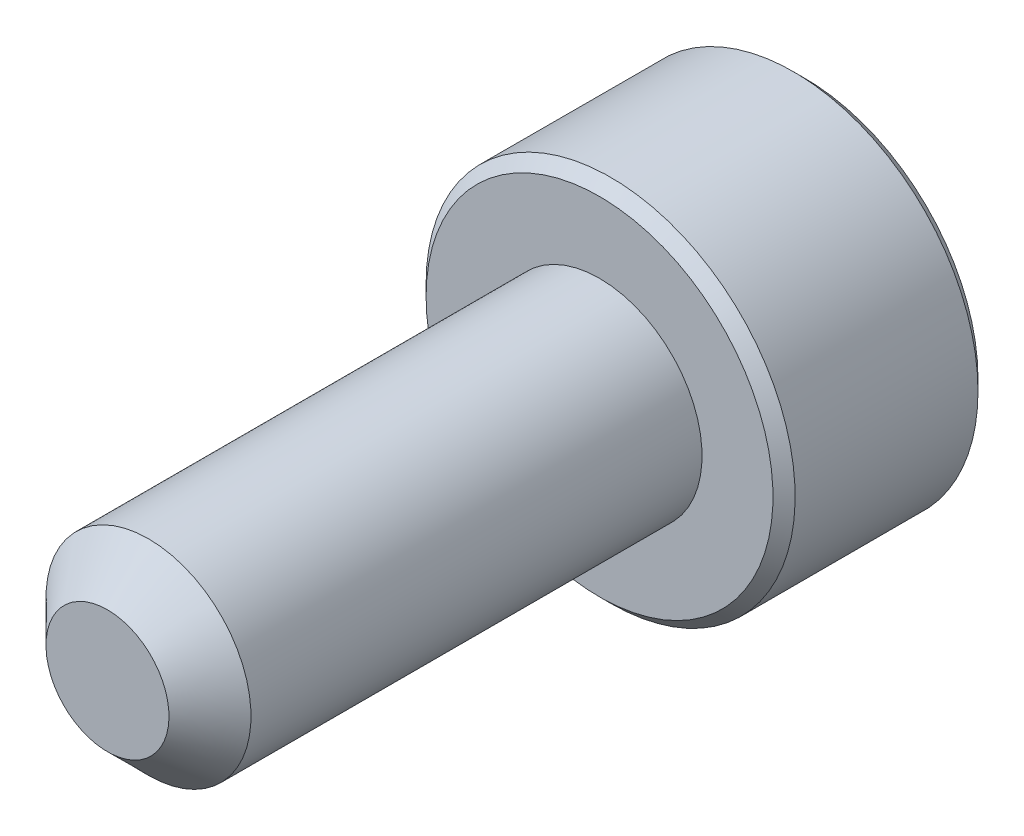
ISO-10303-21;
HEADER;
FILE_DESCRIPTION(('STEP AP214'),'2;1');
FILE_NAME('part.step','',(''),(''),'','','');
FILE_SCHEMA(('AUTOMOTIVE_DESIGN { 1 0 10303 214 1 1 1 1 }'));
ENDSEC;
DATA;
#1=APPLICATION_CONTEXT('core data for automotive mechanical design processes');
#2=APPLICATION_PROTOCOL_DEFINITION('international standard','automotive_design',2000,#1);
#3=PRODUCT_CONTEXT('',#1,'mechanical');
#4=PRODUCT('Part','Part','',(#3));
#5=PRODUCT_RELATED_PRODUCT_CATEGORY('part','',(#4));
#6=PRODUCT_DEFINITION_FORMATION('','',#4);
#7=PRODUCT_DEFINITION_CONTEXT('part definition',#1,'design');
#8=PRODUCT_DEFINITION('design','',#6,#7);
#9=PRODUCT_DEFINITION_SHAPE('','',#8);
#10=(LENGTH_UNIT() NAMED_UNIT(*) SI_UNIT(.MILLI.,.METRE.));
#11=(NAMED_UNIT(*) PLANE_ANGLE_UNIT() SI_UNIT($,.RADIAN.));
#12=(NAMED_UNIT(*) SI_UNIT($,.STERADIAN.) SOLID_ANGLE_UNIT());
#13=UNCERTAINTY_MEASURE_WITH_UNIT(LENGTH_MEASURE(1.E-05),#10,'distance_accuracy_value','');
#14=(GEOMETRIC_REPRESENTATION_CONTEXT(3) GLOBAL_UNCERTAINTY_ASSIGNED_CONTEXT((#13)) GLOBAL_UNIT_ASSIGNED_CONTEXT((#10,
#11,#12)) REPRESENTATION_CONTEXT('',''));
#15=CARTESIAN_POINT('',(0.,0.,0.));
#16=DIRECTION('',(0.,0.,1.));
#17=DIRECTION('',(1.,0.,0.));
#18=AXIS2_PLACEMENT_3D('',#15,#16,#17);
#19=CARTESIAN_POINT('',(-0.999999999999945,-0.577350269189647,-6.99999999999999));
#20=DIRECTION('',(-1.,0.,0.));
#21=DIRECTION('',(0.,-1.,0.));
#22=AXIS2_PLACEMENT_3D('',#19,#20,#21);
#23=PLANE('',#22);
#24=CARTESIAN_POINT('',(-0.999999999999945,0.577350269190027,-8.50000000001262));
#25=CARTESIAN_POINT('',(-0.999999999999945,0.537921916685755,-8.48030421855517));
#26=CARTESIAN_POINT('',(-0.999999999999945,0.497838522943099,-8.46175847655676));
#27=CARTESIAN_POINT('',(-0.999999999999945,0.416089218046397,-8.42776375688669));
#28=CARTESIAN_POINT('',(-0.999999999999945,0.374414806967093,-8.41233540065581));
#29=CARTESIAN_POINT('',(-0.999999999999945,0.289861522962884,-8.3856939453934));
#30=CARTESIAN_POINT('',(-0.999999999999945,0.246987267630393,-8.37446658059238));
#31=CARTESIAN_POINT('',(-0.999999999999945,0.160298880626419,-8.35718156712562));
#32=CARTESIAN_POINT('',(-0.999999999999945,0.116488090760256,-8.35110793188256));
#33=CARTESIAN_POINT('',(-0.999999999999945,0.0604313809769499,-8.34705063441562));
#34=CARTESIAN_POINT('',(-0.999999999999945,0.0483511656802593,-8.34639469636689));
#35=CARTESIAN_POINT('',(-0.999999999999945,0.0241811978518301,-8.34551903058784));
#36=CARTESIAN_POINT('',(-0.999999999999945,0.0120914540759211,-8.34529906589528));
#37=CARTESIAN_POINT('',(-0.999999999999945,-0.030347173158268,-8.34530045485742));
#38=CARTESIAN_POINT('',(-0.999999999999945,-0.060705119690449,-8.34668952341283));
#39=CARTESIAN_POINT('',(-0.999999999999945,-0.121184237328988,-8.35216330142793));
#40=CARTESIAN_POINT('',(-0.999999999999945,-0.151305228451821,-8.35624989103257));
#41=CARTESIAN_POINT('',(-0.999999999999945,-0.241266773027065,-8.37230046210294));
#42=CARTESIAN_POINT('',(-0.999999999999945,-0.300451693273536,-8.38805252340354));
#43=CARTESIAN_POINT('',(-0.999999999999945,-0.396054922754772,-8.42027718346385));
#44=CARTESIAN_POINT('',(-0.999999999999945,-0.433252086820168,-8.43460640136483));
#45=CARTESIAN_POINT('',(-0.999999999999945,-0.50623796164584,-8.46566243983718));
#46=CARTESIAN_POINT('',(-0.999999999999945,-0.542036442977672,-8.48236613193539));
#47=CARTESIAN_POINT('',(-0.999999999999945,-0.577350269190039,-8.50000000001258));
#48=B_SPLINE_CURVE_WITH_KNOTS('',3,(#24,#25,#26,#27,#28,#29,#30,#31,#32,#33,#34,#35,#36,#37,#38,
#39,#40,#41,#42,#43,#44,#45,#46,#47),.UNSPECIFIED.,.F.,.F.,(4,2,2,2,2,2,2,2,2,2,2,4),(0.,
0.132313199455714,0.265474890463239,0.398180194920119,0.530472334347778,0.56676091552446,
0.603029767550235,0.694057457500559,0.785148659918884,0.96808357834418,1.08759246657118,
1.20600826495498),.UNSPECIFIED.);
#49=CARTESIAN_POINT('',(-1.00000000000602,0.57735026919312,-8.50000000001943));
#50=VERTEX_POINT('',#49);
#51=CARTESIAN_POINT('',(-1.00000000000601,-0.577350269193129,-8.50000000001938));
#52=VERTEX_POINT('',#51);
#53=EDGE_CURVE('E21',#50,#52,#48,.T.);
#54=ORIENTED_EDGE('',*,*,#53,.F.);
#55=DIRECTION('',(0.,0.,1.));
#56=VECTOR('',#55,1.);
#57=CARTESIAN_POINT('',(-1.00000000000001,0.577350269189651,-6.99999999999992));
#58=LINE('',#57,#56);
#59=CARTESIAN_POINT('',(-0.999999999999986,0.577350269189663,-6.99999999999995));
#60=VERTEX_POINT('',#59);
#61=EDGE_CURVE('E66',#50,#60,#58,.T.);
#62=ORIENTED_EDGE('',*,*,#61,.T.);
#63=DIRECTION('',(0.,1.,0.));
#64=VECTOR('',#63,1.);
#65=CARTESIAN_POINT('',(-0.999999999999945,1.73205080756887,-6.99999999999999));
#66=LINE('',#65,#64);
#67=CARTESIAN_POINT('',(-0.999999999999944,-0.577350269189646,-6.99999999999998));
#68=VERTEX_POINT('',#67);
#69=EDGE_CURVE('E71',#68,#60,#66,.T.);
#70=ORIENTED_EDGE('',*,*,#69,.F.);
#71=DIRECTION('',(0.,0.,1.));
#72=VECTOR('',#71,1.);
#73=CARTESIAN_POINT('',(-0.999999999999944,-0.577350269189645,-6.99999999999998));
#74=LINE('',#73,#72);
#75=EDGE_CURVE('E69',#68,#52,#74,.F.);
#76=ORIENTED_EDGE('',*,*,#75,.T.);
#77=EDGE_LOOP('',(#54,#62,#70,#76));
#78=FACE_BOUND('',#77,.T.);
#79=ADVANCED_FACE('F17',(#78),#23,.F.);
#80=CARTESIAN_POINT('',(0.999999999999946,1.73205080756887,-6.99999999999999));
#81=DIRECTION('',(0.,0.,-1.));
#82=DIRECTION('',(0.,1.,0.));
#83=AXIS2_PLACEMENT_3D('',#80,#81,#82);
#84=PLANE('',#83);
#85=DIRECTION('',(0.866025403784439,-0.5,0.));
#86=VECTOR('',#85,1.);
#87=CARTESIAN_POINT('',(0.,-1.15470053837924,-6.99999999999998));
#88=LINE('',#87,#86);
#89=CARTESIAN_POINT('',(0.,-1.15470053837928,-6.99999999999997));
#90=VERTEX_POINT('',#89);
#91=EDGE_CURVE('E89',#90,#68,#88,.F.);
#92=ORIENTED_EDGE('',*,*,#91,.T.);
#93=ORIENTED_EDGE('',*,*,#69,.T.);
#94=DIRECTION('',(-0.866025403784439,-0.5,0.));
#95=VECTOR('',#94,1.);
#96=CARTESIAN_POINT('',(-1.,0.577350269189653,-6.99999999999992));
#97=LINE('',#96,#95);
#98=CARTESIAN_POINT('',(0.,1.15470053837928,-6.99999999999995));
#99=VERTEX_POINT('',#98);
#100=EDGE_CURVE('E88',#60,#99,#97,.F.);
#101=ORIENTED_EDGE('',*,*,#100,.T.);
#102=DIRECTION('',(-0.866025403784439,0.5,0.));
#103=VECTOR('',#102,1.);
#104=CARTESIAN_POINT('',(0.,1.15470053837927,-6.99999999999996));
#105=LINE('',#104,#103);
#106=CARTESIAN_POINT('',(1.00000000000005,0.577350269189648,-6.99999999999996));
#107=VERTEX_POINT('',#106);
#108=EDGE_CURVE('E235',#99,#107,#105,.F.);
#109=ORIENTED_EDGE('',*,*,#108,.T.);
#110=DIRECTION('',(0.,1.,0.));
#111=VECTOR('',#110,1.);
#112=CARTESIAN_POINT('',(1.00000000000003,0.577350269189597,-6.99999999999996));
#113=LINE('',#112,#111);
#114=CARTESIAN_POINT('',(1.00000000000003,-0.57735026918967,-6.99999999999996));
#115=VERTEX_POINT('',#114);
#116=EDGE_CURVE('E240',#107,#115,#113,.F.);
#117=ORIENTED_EDGE('',*,*,#116,.T.);
#118=DIRECTION('',(0.866025403784439,0.5,0.));
#119=VECTOR('',#118,1.);
#120=CARTESIAN_POINT('',(1.,-0.577350269189674,-6.99999999999996));
#121=LINE('',#120,#119);
#122=EDGE_CURVE('E245',#115,#90,#121,.F.);
#123=ORIENTED_EDGE('',*,*,#122,.T.);
#124=EDGE_LOOP('',(#92,#93,#101,#109,#117,#123));
#125=FACE_BOUND('',#124,.T.);
#126=ADVANCED_FACE('F169',(#125),#84,.T.);
#127=CARTESIAN_POINT('',(-1.,0.577350269189653,-6.99999999999992));
#128=DIRECTION('',(-0.5,0.866025403784439,0.));
#129=DIRECTION('',(-0.866025403784439,-0.5,0.));
#130=AXIS2_PLACEMENT_3D('',#127,#128,#129);
#131=PLANE('',#130);
#132=CARTESIAN_POINT('',(-1.00000000000031,0.577350269189475,-8.50000000001267));
#133=CARTESIAN_POINT('',(-0.96562946444635,0.597194107143746,-8.48017529969772));
#134=CARTESIAN_POINT('',(-0.930684324317608,0.617369693203944,-8.46151503363672));
#135=CARTESIAN_POINT('',(-0.85942759693806,0.658509783938098,-8.42734887688827));
#136=CARTESIAN_POINT('',(-0.823109236868685,0.679478198900678,-8.4118619899878));
#137=CARTESIAN_POINT('',(-0.749874902280919,0.721760061688847,-8.38533304034807));
#138=CARTESIAN_POINT('',(-0.712977570520169,0.743062746113296,-8.37422431256372));
#139=CARTESIAN_POINT('',(-0.638371399482348,0.786136639045189,-8.35710848690352));
#140=CARTESIAN_POINT('',(-0.600664836281809,0.807906533459236,-8.35108861983243));
#141=CARTESIAN_POINT('',(-0.535672283940884,0.845430001048589,-8.34565888474912));
#142=CARTESIAN_POINT('',(-0.508470695174633,0.86113484564517,-8.34485656692259));
#143=CARTESIAN_POINT('',(-0.454120291273569,0.892514065968014,-8.3462087797417));
#144=CARTESIAN_POINT('',(-0.426971489122761,0.908188434197959,-8.34836396354681));
#145=CARTESIAN_POINT('',(-0.3459129720901,0.954987590826877,-8.35912331969345));
#146=CARTESIAN_POINT('',(-0.29240676263656,0.985879415258195,-8.37202250820472));
#147=CARTESIAN_POINT('',(-0.19853726063635,1.04007499750671,-8.40313768060925));
#148=CARTESIAN_POINT('',(-0.157732128928676,1.06363385128246,-8.41971698773794));
#149=CARTESIAN_POINT('',(-0.0777188012055219,1.10982956758218,-8.4570612849801));
#150=CARTESIAN_POINT('',(-0.0385058937149511,1.13246915027757,-8.47781264965678));
#151=CARTESIAN_POINT('',(1.90759481100758E-12,1.15470053838038,-8.50000000001358));
#152=B_SPLINE_CURVE_WITH_KNOTS('',3,(#132,#133,#134,#135,#136,#137,#138,#139,#140,#141,#142,
#143,#144,#145,#146,#147,#148,#149,#150,#151),.UNSPECIFIED.,.F.,.F.,(4,2,2,2,2,2,2,2,2,4),(0.,
0.133182946580773,0.267141541466459,0.398973326815026,0.530473323703193,0.624596460448788,
0.718740387483229,0.907081600587882,1.05673041330056,1.20589820623807),.UNSPECIFIED.);
#153=CARTESIAN_POINT('',(-1.1059764589726E-11,1.15470053838678,-8.50000000001998));
#154=VERTEX_POINT('',#153);
#155=EDGE_CURVE('E85',#50,#154,#152,.T.);
#156=ORIENTED_EDGE('',*,*,#155,.T.);
#157=DIRECTION('',(0.,0.,1.));
#158=VECTOR('',#157,1.);
#159=CARTESIAN_POINT('',(0.,1.15470053837927,-6.99999999999996));
#160=LINE('',#159,#158);
#161=EDGE_CURVE('E96',#154,#99,#160,.T.);
#162=ORIENTED_EDGE('',*,*,#161,.T.);
#163=ORIENTED_EDGE('',*,*,#100,.F.);
#164=ORIENTED_EDGE('',*,*,#61,.F.);
#165=EDGE_LOOP('',(#156,#162,#163,#164));
#166=FACE_BOUND('',#165,.T.);
#167=ADVANCED_FACE('F83',(#166),#131,.F.);
#168=CARTESIAN_POINT('',(0.,-1.15470053837924,-6.99999999999998));
#169=DIRECTION('',(-0.5,-0.866025403784439,0.));
#170=DIRECTION('',(0.866025403784439,-0.5,0.));
#171=AXIS2_PLACEMENT_3D('',#168,#169,#170);
#172=PLANE('',#171);
#173=CARTESIAN_POINT('',(1.96866247307454E-12,-1.15470053838037,-8.50000000001347));
#174=CARTESIAN_POINT('',(-0.0343705355520851,-1.13485670042605,-8.48017529969842));
#175=CARTESIAN_POINT('',(-0.069315675680921,-1.1146811143658,-8.46151503363733));
#176=CARTESIAN_POINT('',(-0.140572403060668,-1.07354102363153,-8.42734887688868));
#177=CARTESIAN_POINT('',(-0.176890763130148,-1.05257260866889,-8.41186198998812));
#178=CARTESIAN_POINT('',(-0.250125097718129,-1.01029074588059,-8.38533304034823));
#179=CARTESIAN_POINT('',(-0.287022429478993,-0.988988061456081,-8.37422431256381));
#180=CARTESIAN_POINT('',(-0.361628600517045,-0.945914168524054,-8.35710848690349));
#181=CARTESIAN_POINT('',(-0.399335163717704,-0.924144274109938,-8.35108861983236));
#182=CARTESIAN_POINT('',(-0.464327716058753,-0.886620806520513,-8.34565888474901));
#183=CARTESIAN_POINT('',(-0.491529304825006,-0.870915961923931,-8.34485656692247));
#184=CARTESIAN_POINT('',(-0.545879708726076,-0.839536741601083,-8.34620877974156));
#185=CARTESIAN_POINT('',(-0.573028510876888,-0.823862373371136,-8.34836396354666));
#186=CARTESIAN_POINT('',(-0.654087027909556,-0.777063216742214,-8.35912331969327));
#187=CARTESIAN_POINT('',(-0.707593237363101,-0.746171392310893,-8.37202250820453));
#188=CARTESIAN_POINT('',(-0.80146273936309,-0.691975810062503,-8.40313768060896));
#189=CARTESIAN_POINT('',(-0.842267871070546,-0.668416956286885,-8.41971698773754));
#190=CARTESIAN_POINT('',(-0.922281198793283,-0.622221239987405,-8.45706128497944));
#191=CARTESIAN_POINT('',(-0.961494106283655,-0.599581657292131,-8.47781264965596));
#192=CARTESIAN_POINT('',(-1.00000000000032,-0.577350269189427,-8.5000000000126));
#193=B_SPLINE_CURVE_WITH_KNOTS('',3,(#173,#174,#175,#176,#177,#178,#179,#180,#181,#182,#183,
#184,#185,#186,#187,#188,#189,#190,#191,#192),.UNSPECIFIED.,.F.,.F.,(4,2,2,2,2,2,2,2,2,4),(0.,
0.133182946581194,0.267141541467313,0.39897332681631,0.530473323704902,0.624596460450507,
0.718740387484958,0.907081600589617,1.05673041330147,1.20589820623817),.UNSPECIFIED.);
#194=CARTESIAN_POINT('',(0.,-1.15470053838628,-8.50000000001938));
#195=VERTEX_POINT('',#194);
#196=EDGE_CURVE('E95',#195,#52,#193,.T.);
#197=ORIENTED_EDGE('',*,*,#196,.T.);
#198=ORIENTED_EDGE('',*,*,#75,.F.);
#199=ORIENTED_EDGE('',*,*,#91,.F.);
#200=DIRECTION('',(0.,0.,1.));
#201=VECTOR('',#200,1.);
#202=CARTESIAN_POINT('',(0.,-1.15470053837928,-6.99999999999996));
#203=LINE('',#202,#201);
#204=EDGE_CURVE('E243',#90,#195,#203,.F.);
#205=ORIENTED_EDGE('',*,*,#204,.T.);
#206=EDGE_LOOP('',(#197,#198,#199,#205));
#207=FACE_BOUND('',#206,.T.);
#208=ADVANCED_FACE('F160',(#207),#172,.F.);
#209=CARTESIAN_POINT('',(1.,-0.577350269189674,-6.99999999999996));
#210=DIRECTION('',(0.5,-0.866025403784439,0.));
#211=DIRECTION('',(0.866025403784439,0.5,0.));
#212=AXIS2_PLACEMENT_3D('',#209,#210,#211);
#213=PLANE('',#212);
#214=CARTESIAN_POINT('',(1.00000000000197,-0.577350269188536,-8.50000000001349));
#215=CARTESIAN_POINT('',(0.965629464447917,-0.597194107142862,-8.48017529969844));
#216=CARTESIAN_POINT('',(0.930684324319078,-0.617369693203116,-8.46151503363734));
#217=CARTESIAN_POINT('',(0.859427596939324,-0.658509783937389,-8.42734887688869));
#218=CARTESIAN_POINT('',(0.823109236869841,-0.679478198900031,-8.41186198998813));
#219=CARTESIAN_POINT('',(0.749874902281854,-0.721760061688328,-8.38533304034823));
#220=CARTESIAN_POINT('',(0.71297757052099,-0.743062746112842,-8.37422431256381));
#221=CARTESIAN_POINT('',(0.638371399482936,-0.78613663904487,-8.35710848690349));
#222=CARTESIAN_POINT('',(0.600664836282276,-0.807906533458986,-8.35108861983236));
#223=CARTESIAN_POINT('',(0.535672283941227,-0.845430001048412,-8.34565888474901));
#224=CARTESIAN_POINT('',(0.508470695174974,-0.861134845644994,-8.34485656692247));
#225=CARTESIAN_POINT('',(0.454120291273905,-0.892514065967841,-8.34620877974156));
#226=CARTESIAN_POINT('',(0.426971489123094,-0.908188434197787,-8.34836396354666));
#227=CARTESIAN_POINT('',(0.345912972090425,-0.954987590826711,-8.35912331969327));
#228=CARTESIAN_POINT('',(0.292406762636878,-0.985879415258032,-8.37202250820453));
#229=CARTESIAN_POINT('',(0.198537260636611,-1.04007499750658,-8.40313768060905));
#230=CARTESIAN_POINT('',(0.157732128928886,-1.06363385128236,-8.41971698773776));
#231=CARTESIAN_POINT('',(0.0777188012056345,-1.10982956758213,-8.45706128497996));
#232=CARTESIAN_POINT('',(0.038505893715016,-1.13246915027755,-8.47781264965666));
#233=CARTESIAN_POINT('',(-1.88836218036097E-12,-1.15470053838039,-8.50000000001349));
#234=B_SPLINE_CURVE_WITH_KNOTS('',3,(#214,#215,#216,#217,#218,#219,#220,#221,#222,#223,#224,
#225,#226,#227,#228,#229,#230,#231,#232,#233),.UNSPECIFIED.,.F.,.F.,(4,2,2,2,2,2,2,2,2,4),(0.,
0.133182946581208,0.267141541467341,0.398973326816341,0.530473323704936,0.62459646045054,
0.71874038748499,0.907081600589653,1.05673041330251,1.2058982062402),.UNSPECIFIED.);
#235=CARTESIAN_POINT('',(1.00000000000611,-0.577350269193147,-8.50000000001937));
#236=VERTEX_POINT('',#235);
#237=EDGE_CURVE('E143',#236,#195,#234,.T.);
#238=ORIENTED_EDGE('',*,*,#237,.T.);
#239=ORIENTED_EDGE('',*,*,#204,.F.);
#240=ORIENTED_EDGE('',*,*,#122,.F.);
#241=DIRECTION('',(0.,0.,-1.));
#242=VECTOR('',#241,1.);
#243=CARTESIAN_POINT('',(1.00000000000003,-0.577350269189674,-6.99999999999996));
#244=LINE('',#243,#242);
#245=EDGE_CURVE('E238',#115,#236,#244,.T.);
#246=ORIENTED_EDGE('',*,*,#245,.T.);
#247=EDGE_LOOP('',(#238,#239,#240,#246));
#248=FACE_BOUND('',#247,.T.);
#249=ADVANCED_FACE('F156',(#248),#213,.F.);
#250=CARTESIAN_POINT('',(1.00000000000003,0.577350269189597,-6.99999999999996));
#251=DIRECTION('',(1.,0.,0.));
#252=DIRECTION('',(0.,0.,-1.));
#253=AXIS2_PLACEMENT_3D('',#250,#251,#252);
#254=PLANE('',#253);
#255=CARTESIAN_POINT('',(1.00000000000003,0.577350269191835,-8.5000000000135));
#256=CARTESIAN_POINT('',(1.00000000000003,0.53766259328318,-8.48017529969845));
#257=CARTESIAN_POINT('',(1.00000000000003,0.49731142116267,-8.46151503363735));
#258=CARTESIAN_POINT('',(1.00000000000003,0.415031239694122,-8.4273488768887));
#259=CARTESIAN_POINT('',(1.00000000000003,0.373094409768837,-8.41186198998813));
#260=CARTESIAN_POINT('',(1.00000000000003,0.288530684192239,-8.38533304034823));
#261=CARTESIAN_POINT('',(1.00000000000003,0.24592531534321,-8.37422431256381));
#262=CARTESIAN_POINT('',(1.00000000000003,0.159777529479149,-8.3571084869035));
#263=CARTESIAN_POINT('',(1.00000000000003,0.116237740650914,-8.35108861983236));
#264=CARTESIAN_POINT('',(1.00000000000003,0.0411908054720612,-8.34565888474901));
#265=CARTESIAN_POINT('',(1.00000000000003,0.00978111627889801,-8.34485656692247));
#266=CARTESIAN_POINT('',(1.00000000000003,-0.0529773243667962,-8.34620877974156));
#267=CARTESIAN_POINT('',(1.00000000000003,-0.0843260608266897,-8.34836396354666));
#268=CARTESIAN_POINT('',(1.00000000000003,-0.177924374084537,-8.35912331969327));
#269=CARTESIAN_POINT('',(1.00000000000003,-0.23970802294718,-8.37202250820453));
#270=CARTESIAN_POINT('',(1.00000000000003,-0.34809918744427,-8.40313768060905));
#271=CARTESIAN_POINT('',(1.00000000000003,-0.395216894995806,-8.41971698773775));
#272=CARTESIAN_POINT('',(1.00000000000003,-0.48760832759534,-8.45706128497994));
#273=CARTESIAN_POINT('',(1.00000000000003,-0.532887492986164,-8.47781264965663));
#274=CARTESIAN_POINT('',(1.00000000000003,-0.577350269191838,-8.50000000001346));
#275=B_SPLINE_CURVE_WITH_KNOTS('',3,(#255,#256,#257,#258,#259,#260,#261,#262,#263,#264,#265,
#266,#267,#268,#269,#270,#271,#272,#273,#274),.UNSPECIFIED.,.F.,.F.,(4,2,2,2,2,2,2,2,2,4),(0.,
0.133182946581215,0.267141541467353,0.398973326816359,0.530473323704961,0.624596460450564,
0.718740387485014,0.907081600589678,1.0567304133025,1.20589820624016),.UNSPECIFIED.);
#276=CARTESIAN_POINT('',(1.0000000000061,0.577350269193127,-8.5000000000194));
#277=VERTEX_POINT('',#276);
#278=EDGE_CURVE('E105',#277,#236,#275,.T.);
#279=ORIENTED_EDGE('',*,*,#278,.T.);
#280=ORIENTED_EDGE('',*,*,#245,.F.);
#281=ORIENTED_EDGE('',*,*,#116,.F.);
#282=DIRECTION('',(0.,0.,1.));
#283=VECTOR('',#282,1.);
#284=CARTESIAN_POINT('',(1.00000000000006,0.577350269189648,-6.99999999999996));
#285=LINE('',#284,#283);
#286=EDGE_CURVE('E41',#107,#277,#285,.F.);
#287=ORIENTED_EDGE('',*,*,#286,.T.);
#288=EDGE_LOOP('',(#279,#280,#281,#287));
#289=FACE_BOUND('',#288,.T.);
#290=ADVANCED_FACE('F159',(#289),#254,.F.);
#291=CARTESIAN_POINT('',(0.,1.15470053837927,-6.99999999999996));
#292=DIRECTION('',(0.5,0.866025403784439,0.));
#293=DIRECTION('',(-0.866025403784439,0.5,0.));
#294=AXIS2_PLACEMENT_3D('',#291,#292,#293);
#295=PLANE('',#294);
#296=CARTESIAN_POINT('',(-1.82470196527733E-12,1.15470053838036,-8.50000000001356));
#297=CARTESIAN_POINT('',(0.0343705355522321,1.13485670042603,-8.48017529969851));
#298=CARTESIAN_POINT('',(0.0693156756810703,1.11468111436578,-8.46151503363741));
#299=CARTESIAN_POINT('',(0.140572403060822,1.07354102363151,-8.42734887688877));
#300=CARTESIAN_POINT('',(0.176890763130304,1.05257260866887,-8.4118619899882));
#301=CARTESIAN_POINT('',(0.250125097718288,1.01029074588057,-8.38533304034831));
#302=CARTESIAN_POINT('',(0.287022429479151,0.988988061456058,-8.3742243125639));
#303=CARTESIAN_POINT('',(0.361628600517203,0.945914168524031,-8.35710848690358));
#304=CARTESIAN_POINT('',(0.399335163717862,0.924144274109916,-8.35108861983245));
#305=CARTESIAN_POINT('',(0.464327716058911,0.88662080652049,-8.3456588847491));
#306=CARTESIAN_POINT('',(0.491529304825166,0.870915961923907,-8.34485656692256));
#307=CARTESIAN_POINT('',(0.54587970872624,0.839536741601057,-8.34620877974165));
#308=CARTESIAN_POINT('',(0.573028510877053,0.823862373371109,-8.34836396354675));
#309=CARTESIAN_POINT('',(0.654087027909729,0.777063216742182,-8.35912331969336));
#310=CARTESIAN_POINT('',(0.70759323736328,0.746171392310858,-8.37202250820462));
#311=CARTESIAN_POINT('',(0.801462739363534,0.691975810062315,-8.40313768060915));
#312=CARTESIAN_POINT('',(0.842267871071241,0.668416956286552,-8.41971698773784));
#313=CARTESIAN_POINT('',(0.922281198794461,0.622221239986793,-8.45706128498002));
#314=CARTESIAN_POINT('',(0.961494106285064,0.599581657291386,-8.47781264965671));
#315=CARTESIAN_POINT('',(1.00000000000195,0.577350269188553,-8.50000000001353));
#316=B_SPLINE_CURVE_WITH_KNOTS('',3,(#296,#297,#298,#299,#300,#301,#302,#303,#304,#305,#306,
#307,#308,#309,#310,#311,#312,#313,#314,#315),.UNSPECIFIED.,.F.,.F.,(4,2,2,2,2,2,2,2,2,4),(0.,
0.133182946581202,0.267141541467329,0.398973326816324,0.530473323704915,0.624596460450526,
0.718740387484983,0.907081600589662,1.05673041330245,1.20589820624008),.UNSPECIFIED.);
#317=EDGE_CURVE('E103',#154,#277,#316,.T.);
#318=ORIENTED_EDGE('',*,*,#317,.T.);
#319=ORIENTED_EDGE('',*,*,#286,.F.);
#320=ORIENTED_EDGE('',*,*,#108,.F.);
#321=ORIENTED_EDGE('',*,*,#161,.F.);
#322=EDGE_LOOP('',(#318,#319,#320,#321));
#323=FACE_BOUND('',#322,.T.);
#324=ADVANCED_FACE('F122',(#323),#295,.F.);
#325=CARTESIAN_POINT('',(0.,0.,-8.50000000008322));
#326=DIRECTION('',(0.,0.,-1.));
#327=DIRECTION('',(-1.,0.,0.));
#328=AXIS2_PLACEMENT_3D('',#325,#326,#327);
#329=CONICAL_SURFACE('',#328,1.15470053845007,0.785398163397448);
#330=ORIENTED_EDGE('',*,*,#155,.F.);
#331=CARTESIAN_POINT('',(0.,0.,-8.50000000002638));
#332=DIRECTION('',(0.,0.,-1.));
#333=DIRECTION('',(-1.,0.,0.));
#334=AXIS2_PLACEMENT_3D('',#331,#332,#333);
#335=CIRCLE('',#334,1.15470053839323);
#336=EDGE_CURVE('E79',#154,#50,#335,.F.);
#337=ORIENTED_EDGE('',*,*,#336,.F.);
#338=EDGE_LOOP('',(#330,#337));
#339=FACE_BOUND('',#338,.T.);
#340=ADVANCED_FACE('F93',(#339),#329,.F.);
#341=CARTESIAN_POINT('',(0.,0.,-8.50000000008322));
#342=DIRECTION('',(0.,0.,-1.));
#343=DIRECTION('',(-1.,0.,0.));
#344=AXIS2_PLACEMENT_3D('',#341,#342,#343);
#345=CONICAL_SURFACE('',#344,1.15470053845007,0.785398163397448);
#346=ORIENTED_EDGE('',*,*,#53,.T.);
#347=CARTESIAN_POINT('',(0.,0.,-8.50000000002632));
#348=DIRECTION('',(0.,0.,-1.));
#349=DIRECTION('',(-1.,0.,0.));
#350=AXIS2_PLACEMENT_3D('',#347,#348,#349);
#351=CIRCLE('',#350,1.15470053839317);
#352=EDGE_CURVE('E73',#50,#52,#351,.F.);
#353=ORIENTED_EDGE('',*,*,#352,.F.);
#354=EDGE_LOOP('',(#346,#353));
#355=FACE_BOUND('',#354,.T.);
#356=ADVANCED_FACE('F74',(#355),#345,.F.);
#357=CARTESIAN_POINT('',(0.,0.,-8.50000000008322));
#358=DIRECTION('',(0.,0.,-1.));
#359=DIRECTION('',(-1.,0.,0.));
#360=AXIS2_PLACEMENT_3D('',#357,#358,#359);
#361=CONICAL_SURFACE('',#360,1.15470053845007,0.785398163397448);
#362=ORIENTED_EDGE('',*,*,#196,.F.);
#363=CARTESIAN_POINT('',(0.,0.,-8.50000000002638));
#364=DIRECTION('',(0.,0.,-1.));
#365=DIRECTION('',(-1.,0.,0.));
#366=AXIS2_PLACEMENT_3D('',#363,#364,#365);
#367=CIRCLE('',#366,1.15470053839323);
#368=EDGE_CURVE('E78',#52,#195,#367,.F.);
#369=ORIENTED_EDGE('',*,*,#368,.F.);
#370=EDGE_LOOP('',(#362,#369));
#371=FACE_BOUND('',#370,.T.);
#372=ADVANCED_FACE('F140',(#371),#361,.F.);
#373=CARTESIAN_POINT('',(0.,0.,-8.50000000008322));
#374=DIRECTION('',(0.,0.,-1.));
#375=DIRECTION('',(-1.,0.,0.));
#376=AXIS2_PLACEMENT_3D('',#373,#374,#375);
#377=CONICAL_SURFACE('',#376,1.15470053845007,0.785398163397448);
#378=ORIENTED_EDGE('',*,*,#237,.F.);
#379=CARTESIAN_POINT('',(0.,0.,-8.50000000002638));
#380=DIRECTION('',(0.,0.,-1.));
#381=DIRECTION('',(-1.,0.,0.));
#382=AXIS2_PLACEMENT_3D('',#379,#380,#381);
#383=CIRCLE('',#382,1.15470053839323);
#384=EDGE_CURVE('E285',#195,#236,#383,.F.);
#385=ORIENTED_EDGE('',*,*,#384,.F.);
#386=EDGE_LOOP('',(#378,#385));
#387=FACE_BOUND('',#386,.T.);
#388=ADVANCED_FACE('F135',(#387),#377,.F.);
#389=CARTESIAN_POINT('',(0.,0.,-8.50000000008322));
#390=DIRECTION('',(0.,0.,-1.));
#391=DIRECTION('',(-1.,0.,0.));
#392=AXIS2_PLACEMENT_3D('',#389,#390,#391);
#393=CONICAL_SURFACE('',#392,1.15470053845007,0.785398163397448);
#394=ORIENTED_EDGE('',*,*,#278,.F.);
#395=CARTESIAN_POINT('',(0.,0.,-8.50000000002638));
#396=DIRECTION('',(0.,0.,-1.));
#397=DIRECTION('',(-1.,0.,0.));
#398=AXIS2_PLACEMENT_3D('',#395,#396,#397);
#399=CIRCLE('',#398,1.15470053839323);
#400=EDGE_CURVE('E283',#236,#277,#399,.F.);
#401=ORIENTED_EDGE('',*,*,#400,.F.);
#402=EDGE_LOOP('',(#394,#401));
#403=FACE_BOUND('',#402,.T.);
#404=ADVANCED_FACE('F129',(#403),#393,.F.);
#405=CARTESIAN_POINT('',(0.,0.,-8.50000000008322));
#406=DIRECTION('',(0.,0.,-1.));
#407=DIRECTION('',(-1.,0.,0.));
#408=AXIS2_PLACEMENT_3D('',#405,#406,#407);
#409=CONICAL_SURFACE('',#408,1.15470053845007,0.785398163397448);
#410=ORIENTED_EDGE('',*,*,#317,.F.);
#411=CARTESIAN_POINT('',(0.,0.,-8.50000000002638));
#412=DIRECTION('',(0.,0.,-1.));
#413=DIRECTION('',(-1.,0.,0.));
#414=AXIS2_PLACEMENT_3D('',#411,#412,#413);
#415=CIRCLE('',#414,1.15470053839323);
#416=EDGE_CURVE('E102',#277,#154,#415,.F.);
#417=ORIENTED_EDGE('',*,*,#416,.F.);
#418=EDGE_LOOP('',(#410,#417));
#419=FACE_BOUND('',#418,.T.);
#420=ADVANCED_FACE('F125',(#419),#409,.F.);
#421=CARTESIAN_POINT('',(0.,0.,-8.49999999999999));
#422=DIRECTION('',(0.,0.,-1.));
#423=DIRECTION('',(0.,1.,0.));
#424=AXIS2_PLACEMENT_3D('',#421,#422,#423);
#425=PLANE('',#424);
#426=ORIENTED_EDGE('',*,*,#400,.T.);
#427=ORIENTED_EDGE('',*,*,#416,.T.);
#428=ORIENTED_EDGE('',*,*,#336,.T.);
#429=ORIENTED_EDGE('',*,*,#352,.T.);
#430=ORIENTED_EDGE('',*,*,#368,.T.);
#431=ORIENTED_EDGE('',*,*,#384,.T.);
#432=EDGE_LOOP('',(#426,#427,#428,#429,#430,#431));
#433=FACE_BOUND('',#432,.T.);
#434=CARTESIAN_POINT('',(0.,0.,-8.49999999996953));
#435=DIRECTION('',(0.,0.,1.));
#436=DIRECTION('',(1.,0.,0.));
#437=AXIS2_PLACEMENT_3D('',#434,#435,#436);
#438=CIRCLE('',#437,2.11500000000336);
#439=CARTESIAN_POINT('',(2.11500000000342,0.,-8.49999999996953));
#440=VERTEX_POINT('',#439);
#441=EDGE_CURVE('E220',#440,#440,#438,.T.);
#442=ORIENTED_EDGE('',*,*,#441,.F.);
#443=EDGE_LOOP('',(#442));
#444=FACE_BOUND('',#443,.T.);
#445=ADVANCED_FACE('F99',(#433,#444),#425,.T.);
#446=CARTESIAN_POINT('',(0.,0.,-8.36499999996931));
#447=DIRECTION('',(0.,0.,1.));
#448=DIRECTION('',(1.,0.,0.));
#449=AXIS2_PLACEMENT_3D('',#446,#447,#448);
#450=CONICAL_SURFACE('',#449,2.25000000006043,0.78539816360798);
#451=ORIENTED_EDGE('',*,*,#441,.T.);
#452=EDGE_LOOP('',(#451));
#453=FACE_BOUND('',#452,.T.);
#454=CARTESIAN_POINT('',(0.,0.,-8.36499999999998));
#455=DIRECTION('',(0.,0.,1.));
#456=DIRECTION('',(0.,-1.,0.));
#457=AXIS2_PLACEMENT_3D('',#454,#455,#456);
#458=CIRCLE('',#457,2.24999999999999);
#459=CARTESIAN_POINT('',(0.,-2.25000000000004,-8.36499999999998));
#460=VERTEX_POINT('',#459);
#461=EDGE_CURVE('E223',#460,#460,#458,.T.);
#462=ORIENTED_EDGE('',*,*,#461,.F.);
#463=EDGE_LOOP('',(#462));
#464=FACE_BOUND('',#463,.T.);
#465=ADVANCED_FACE('F210',(#453,#464),#450,.T.);
#466=CARTESIAN_POINT('',(0.,0.,-8.49999999999999));
#467=DIRECTION('',(0.,0.,1.));
#468=DIRECTION('',(0.,-1.,0.));
#469=AXIS2_PLACEMENT_3D('',#466,#467,#468);
#470=CYLINDRICAL_SURFACE('',#469,2.24999999999999);
#471=ORIENTED_EDGE('',*,*,#461,.T.);
#472=EDGE_LOOP('',(#471));
#473=FACE_BOUND('',#472,.T.);
#474=CARTESIAN_POINT('',(1.10154940724521E-13,0.,-6.13500000002887));
#475=DIRECTION('',(0.,0.,-1.));
#476=DIRECTION('',(-1.,0.,0.));
#477=AXIS2_PLACEMENT_3D('',#474,#475,#476);
#478=CIRCLE('',#477,2.2499999999469);
#479=CARTESIAN_POINT('',(-2.24999999994679,0.,-6.13500000002887));
#480=VERTEX_POINT('',#479);
#481=EDGE_CURVE('E224',#480,#480,#478,.F.);
#482=ORIENTED_EDGE('',*,*,#481,.F.);
#483=EDGE_LOOP('',(#482));
#484=FACE_BOUND('',#483,.T.);
#485=ADVANCED_FACE('F207',(#473,#484),#470,.T.);
#486=CARTESIAN_POINT('',(1.10154940724527E-13,0.,-6.13500000008571));
#487=DIRECTION('',(0.,0.,-1.));
#488=DIRECTION('',(-1.,0.,0.));
#489=AXIS2_PLACEMENT_3D('',#486,#487,#488);
#490=CONICAL_SURFACE('',#489,2.25000000000375,0.785398163397448);
#491=CARTESIAN_POINT('',(1.10206982428807E-13,0.,-6.00000000008538));
#492=DIRECTION('',(0.,0.,-1.));
#493=DIRECTION('',(-1.,0.,0.));
#494=AXIS2_PLACEMENT_3D('',#491,#492,#493);
#495=CIRCLE('',#494,2.11500000000342);
#496=CARTESIAN_POINT('',(-2.11500000000331,0.,-6.00000000008538));
#497=VERTEX_POINT('',#496);
#498=EDGE_CURVE('E227',#497,#497,#495,.T.);
#499=ORIENTED_EDGE('',*,*,#498,.T.);
#500=EDGE_LOOP('',(#499));
#501=FACE_BOUND('',#500,.T.);
#502=ORIENTED_EDGE('',*,*,#481,.T.);
#503=EDGE_LOOP('',(#502));
#504=FACE_BOUND('',#503,.T.);
#505=ADVANCED_FACE('F203',(#501,#504),#490,.T.);
#506=CARTESIAN_POINT('',(0.,0.,0.));
#507=DIRECTION('',(0.,0.,1.));
#508=DIRECTION('',(0.,-1.,0.));
#509=AXIS2_PLACEMENT_3D('',#506,#507,#508);
#510=PLANE('',#509);
#511=CARTESIAN_POINT('',(0.,0.,0.));
#512=DIRECTION('',(0.,0.,-1.));
#513=DIRECTION('',(0.,1.,0.));
#514=AXIS2_PLACEMENT_3D('',#511,#512,#513);
#515=CIRCLE('',#514,0.749999999982265);
#516=CARTESIAN_POINT('',(0.,0.749999999982265,0.));
#517=VERTEX_POINT('',#516);
#518=EDGE_CURVE('E277',#517,#517,#515,.T.);
#519=ORIENTED_EDGE('',*,*,#518,.F.);
#520=EDGE_LOOP('',(#519));
#521=FACE_BOUND('',#520,.T.);
#522=ADVANCED_FACE('F199',(#521),#510,.T.);
#523=CARTESIAN_POINT('',(0.,0.,-5.99999999999998));
#524=DIRECTION('',(0.,0.,-1.));
#525=DIRECTION('',(0.,1.,0.));
#526=AXIS2_PLACEMENT_3D('',#523,#524,#525);
#527=PLANE('',#526);
#528=CARTESIAN_POINT('',(0.,0.,-5.99999999999998));
#529=DIRECTION('',(0.,0.,1.));
#530=DIRECTION('',(0.,-1.,0.));
#531=AXIS2_PLACEMENT_3D('',#528,#529,#530);
#532=CIRCLE('',#531,1.25);
#533=CARTESIAN_POINT('',(0.,-1.25000000000008,-5.99999999999998));
#534=VERTEX_POINT('',#533);
#535=EDGE_CURVE('E32',#534,#534,#532,.T.);
#536=ORIENTED_EDGE('',*,*,#535,.F.);
#537=EDGE_LOOP('',(#536));
#538=FACE_BOUND('',#537,.T.);
#539=ORIENTED_EDGE('',*,*,#498,.F.);
#540=EDGE_LOOP('',(#539));
#541=FACE_BOUND('',#540,.T.);
#542=ADVANCED_FACE('F191',(#538,#541),#527,.F.);
#543=CARTESIAN_POINT('',(0.,0.,-0.499999999931333));
#544=DIRECTION('',(0.,0.,-1.));
#545=DIRECTION('',(0.,1.,0.));
#546=AXIS2_PLACEMENT_3D('',#543,#544,#545);
#547=CONICAL_SURFACE('',#546,1.2499999999136,0.785398163397448);
#548=CARTESIAN_POINT('',(0.,0.,-0.500000000000028));
#549=DIRECTION('',(0.,0.,1.));
#550=DIRECTION('',(0.,-1.,0.));
#551=AXIS2_PLACEMENT_3D('',#548,#549,#550);
#552=CIRCLE('',#551,1.25);
#553=CARTESIAN_POINT('',(0.,-1.25000000000008,-0.500000000000028));
#554=VERTEX_POINT('',#553);
#555=EDGE_CURVE('E11',#554,#554,#552,.F.);
#556=ORIENTED_EDGE('',*,*,#555,.F.);
#557=EDGE_LOOP('',(#556));
#558=FACE_BOUND('',#557,.T.);
#559=ORIENTED_EDGE('',*,*,#518,.T.);
#560=EDGE_LOOP('',(#559));
#561=FACE_BOUND('',#560,.T.);
#562=ADVANCED_FACE('F185',(#558,#561),#547,.T.);
#563=CARTESIAN_POINT('',(0.,0.,-5.99999999999998));
#564=DIRECTION('',(0.,0.,1.));
#565=DIRECTION('',(0.,-1.,0.));
#566=AXIS2_PLACEMENT_3D('',#563,#564,#565);
#567=CYLINDRICAL_SURFACE('',#566,1.25);
#568=ORIENTED_EDGE('',*,*,#535,.T.);
#569=EDGE_LOOP('',(#568));
#570=FACE_BOUND('',#569,.T.);
#571=ORIENTED_EDGE('',*,*,#555,.T.);
#572=EDGE_LOOP('',(#571));
#573=FACE_BOUND('',#572,.T.);
#574=ADVANCED_FACE('F183',(#570,#573),#567,.T.);
#575=CLOSED_SHELL('',(#79,#126,#167,#208,#249,#290,#324,#340,#356,#372,#388,#404,#420,#445,#465,
#485,#505,#522,#542,#562,#574));
#576=MANIFOLD_SOLID_BREP('B1',#575);
#577=ADVANCED_BREP_SHAPE_REPRESENTATION('',(#18,#576),#14);
#578=SHAPE_DEFINITION_REPRESENTATION(#9,#577);
ENDSEC;
END-ISO-10303-21;
